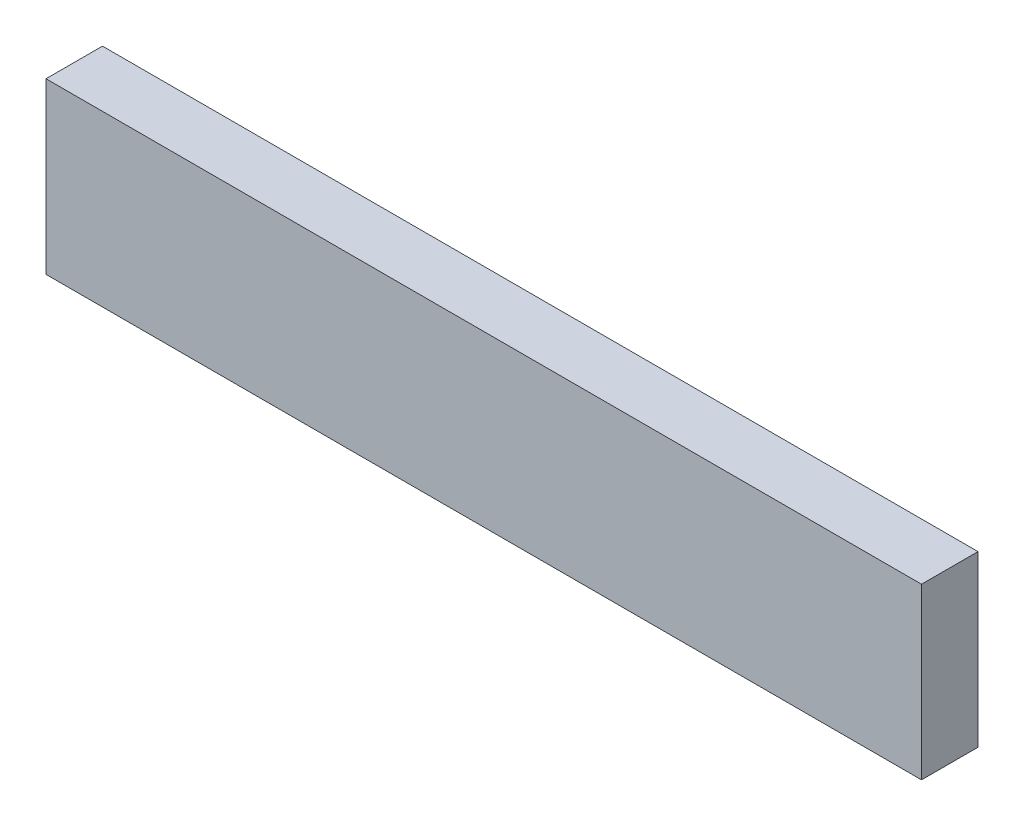
ISO-10303-21;
HEADER;
FILE_DESCRIPTION(('STEP AP214'),'2;1');
FILE_NAME('part.step','',(''),(''),'','','');
FILE_SCHEMA(('AUTOMOTIVE_DESIGN { 1 0 10303 214 1 1 1 1 }'));
ENDSEC;
DATA;
#1=APPLICATION_CONTEXT('core data for automotive mechanical design processes');
#2=APPLICATION_PROTOCOL_DEFINITION('international standard','automotive_design',2000,#1);
#3=PRODUCT_CONTEXT('',#1,'mechanical');
#4=PRODUCT('Part','Part','',(#3));
#5=PRODUCT_RELATED_PRODUCT_CATEGORY('part','',(#4));
#6=PRODUCT_DEFINITION_FORMATION('','',#4);
#7=PRODUCT_DEFINITION_CONTEXT('part definition',#1,'design');
#8=PRODUCT_DEFINITION('design','',#6,#7);
#9=PRODUCT_DEFINITION_SHAPE('','',#8);
#10=(LENGTH_UNIT() NAMED_UNIT(*) SI_UNIT(.MILLI.,.METRE.));
#11=(NAMED_UNIT(*) PLANE_ANGLE_UNIT() SI_UNIT($,.RADIAN.));
#12=(NAMED_UNIT(*) SI_UNIT($,.STERADIAN.) SOLID_ANGLE_UNIT());
#13=UNCERTAINTY_MEASURE_WITH_UNIT(LENGTH_MEASURE(1.E-05),#10,'distance_accuracy_value','');
#14=(GEOMETRIC_REPRESENTATION_CONTEXT(3) GLOBAL_UNCERTAINTY_ASSIGNED_CONTEXT((#13)) GLOBAL_UNIT_ASSIGNED_CONTEXT((#10,
#11,#12)) REPRESENTATION_CONTEXT('',''));
#15=CARTESIAN_POINT('',(0.,0.,0.));
#16=DIRECTION('',(0.,0.,1.));
#17=DIRECTION('',(1.,0.,0.));
#18=AXIS2_PLACEMENT_3D('',#15,#16,#17);
#19=CARTESIAN_POINT('',(155.,-30.,20.));
#20=DIRECTION('',(-1.,0.,0.));
#21=DIRECTION('',(0.,0.,1.));
#22=AXIS2_PLACEMENT_3D('',#19,#20,#21);
#23=PLANE('',#22);
#24=DIRECTION('',(0.,1.,0.));
#25=VECTOR('',#24,1.);
#26=CARTESIAN_POINT('',(155.,-30.,0.));
#27=LINE('',#26,#25);
#28=CARTESIAN_POINT('',(155.,-30.,0.));
#29=VERTEX_POINT('',#28);
#30=CARTESIAN_POINT('',(155.,30.,0.));
#31=VERTEX_POINT('',#30);
#32=EDGE_CURVE('E113',#29,#31,#27,.T.);
#33=ORIENTED_EDGE('',*,*,#32,.T.);
#34=DIRECTION('',(0.,0.,-1.));
#35=VECTOR('',#34,1.);
#36=CARTESIAN_POINT('',(155.,30.,20.));
#37=LINE('',#36,#35);
#38=CARTESIAN_POINT('',(155.,30.,20.));
#39=VERTEX_POINT('',#38);
#40=EDGE_CURVE('E11',#39,#31,#37,.T.);
#41=ORIENTED_EDGE('',*,*,#40,.F.);
#42=DIRECTION('',(0.,1.,0.));
#43=VECTOR('',#42,1.);
#44=CARTESIAN_POINT('',(155.,-30.,20.));
#45=LINE('',#44,#43);
#46=CARTESIAN_POINT('',(155.,-30.,20.));
#47=VERTEX_POINT('',#46);
#48=EDGE_CURVE('E97',#47,#39,#45,.T.);
#49=ORIENTED_EDGE('',*,*,#48,.F.);
#50=DIRECTION('',(0.,0.,-1.));
#51=VECTOR('',#50,1.);
#52=CARTESIAN_POINT('',(155.,-30.,20.));
#53=LINE('',#52,#51);
#54=EDGE_CURVE('E109',#47,#29,#53,.T.);
#55=ORIENTED_EDGE('',*,*,#54,.T.);
#56=EDGE_LOOP('',(#33,#41,#49,#55));
#57=FACE_BOUND('',#56,.T.);
#58=ADVANCED_FACE('F45',(#57),#23,.F.);
#59=CARTESIAN_POINT('',(-155.,30.,20.));
#60=DIRECTION('',(0.,-1.,0.));
#61=DIRECTION('',(0.,0.,-1.));
#62=AXIS2_PLACEMENT_3D('',#59,#60,#61);
#63=PLANE('',#62);
#64=DIRECTION('',(-1.,0.,0.));
#65=VECTOR('',#64,1.);
#66=CARTESIAN_POINT('',(-155.,30.,0.));
#67=LINE('',#66,#65);
#68=CARTESIAN_POINT('',(-155.,30.,0.));
#69=VERTEX_POINT('',#68);
#70=EDGE_CURVE('E102',#31,#69,#67,.T.);
#71=ORIENTED_EDGE('',*,*,#70,.T.);
#72=DIRECTION('',(0.,0.,-1.));
#73=VECTOR('',#72,1.);
#74=CARTESIAN_POINT('',(-155.,30.,20.));
#75=LINE('',#74,#73);
#76=CARTESIAN_POINT('',(-155.,30.,20.));
#77=VERTEX_POINT('',#76);
#78=EDGE_CURVE('E54',#77,#69,#75,.T.);
#79=ORIENTED_EDGE('',*,*,#78,.F.);
#80=DIRECTION('',(-1.,0.,0.));
#81=VECTOR('',#80,1.);
#82=CARTESIAN_POINT('',(-155.,30.,20.));
#83=LINE('',#82,#81);
#84=EDGE_CURVE('E92',#39,#77,#83,.T.);
#85=ORIENTED_EDGE('',*,*,#84,.F.);
#86=ORIENTED_EDGE('',*,*,#40,.T.);
#87=EDGE_LOOP('',(#71,#79,#85,#86));
#88=FACE_BOUND('',#87,.T.);
#89=ADVANCED_FACE('F101',(#88),#63,.F.);
#90=CARTESIAN_POINT('',(-155.,-30.,20.));
#91=DIRECTION('',(1.,0.,0.));
#92=DIRECTION('',(0.,0.,-1.));
#93=AXIS2_PLACEMENT_3D('',#90,#91,#92);
#94=PLANE('',#93);
#95=DIRECTION('',(0.,-1.,0.));
#96=VECTOR('',#95,1.);
#97=CARTESIAN_POINT('',(-155.,-30.,0.));
#98=LINE('',#97,#96);
#99=CARTESIAN_POINT('',(-155.,-30.,0.));
#100=VERTEX_POINT('',#99);
#101=EDGE_CURVE('E79',#69,#100,#98,.T.);
#102=ORIENTED_EDGE('',*,*,#101,.T.);
#103=DIRECTION('',(0.,0.,-1.));
#104=VECTOR('',#103,1.);
#105=CARTESIAN_POINT('',(-155.,-30.,20.));
#106=LINE('',#105,#104);
#107=CARTESIAN_POINT('',(-155.,-30.,20.));
#108=VERTEX_POINT('',#107);
#109=EDGE_CURVE('E104',#108,#100,#106,.T.);
#110=ORIENTED_EDGE('',*,*,#109,.F.);
#111=DIRECTION('',(0.,-1.,0.));
#112=VECTOR('',#111,1.);
#113=CARTESIAN_POINT('',(-155.,-30.,20.));
#114=LINE('',#113,#112);
#115=EDGE_CURVE('E95',#77,#108,#114,.T.);
#116=ORIENTED_EDGE('',*,*,#115,.F.);
#117=ORIENTED_EDGE('',*,*,#78,.T.);
#118=EDGE_LOOP('',(#102,#110,#116,#117));
#119=FACE_BOUND('',#118,.T.);
#120=ADVANCED_FACE('F105',(#119),#94,.F.);
#121=CARTESIAN_POINT('',(-155.,-30.,20.));
#122=DIRECTION('',(0.,1.,0.));
#123=DIRECTION('',(0.,0.,1.));
#124=AXIS2_PLACEMENT_3D('',#121,#122,#123);
#125=PLANE('',#124);
#126=DIRECTION('',(1.,0.,0.));
#127=VECTOR('',#126,1.);
#128=CARTESIAN_POINT('',(-155.,-30.,0.));
#129=LINE('',#128,#127);
#130=EDGE_CURVE('E85',#100,#29,#129,.T.);
#131=ORIENTED_EDGE('',*,*,#130,.T.);
#132=ORIENTED_EDGE('',*,*,#54,.F.);
#133=DIRECTION('',(1.,0.,0.));
#134=VECTOR('',#133,1.);
#135=CARTESIAN_POINT('',(-155.,-30.,20.));
#136=LINE('',#135,#134);
#137=EDGE_CURVE('E62',#108,#47,#136,.T.);
#138=ORIENTED_EDGE('',*,*,#137,.F.);
#139=ORIENTED_EDGE('',*,*,#109,.T.);
#140=EDGE_LOOP('',(#131,#132,#138,#139));
#141=FACE_BOUND('',#140,.T.);
#142=ADVANCED_FACE('F126',(#141),#125,.F.);
#143=CARTESIAN_POINT('',(0.,0.,20.));
#144=DIRECTION('',(0.,0.,-1.));
#145=DIRECTION('',(-1.,0.,0.));
#146=AXIS2_PLACEMENT_3D('',#143,#144,#145);
#147=PLANE('',#146);
#148=ORIENTED_EDGE('',*,*,#48,.T.);
#149=ORIENTED_EDGE('',*,*,#84,.T.);
#150=ORIENTED_EDGE('',*,*,#115,.T.);
#151=ORIENTED_EDGE('',*,*,#137,.T.);
#152=EDGE_LOOP('',(#148,#149,#150,#151));
#153=FACE_BOUND('',#152,.T.);
#154=ADVANCED_FACE('F93',(#153),#147,.F.);
#155=CARTESIAN_POINT('',(0.,0.,0.));
#156=DIRECTION('',(0.,0.,-1.));
#157=DIRECTION('',(-1.,0.,0.));
#158=AXIS2_PLACEMENT_3D('',#155,#156,#157);
#159=PLANE('',#158);
#160=ORIENTED_EDGE('',*,*,#32,.F.);
#161=ORIENTED_EDGE('',*,*,#130,.F.);
#162=ORIENTED_EDGE('',*,*,#101,.F.);
#163=ORIENTED_EDGE('',*,*,#70,.F.);
#164=EDGE_LOOP('',(#160,#161,#162,#163));
#165=FACE_BOUND('',#164,.T.);
#166=ADVANCED_FACE('F129',(#165),#159,.T.);
#167=CLOSED_SHELL('',(#58,#89,#120,#142,#154,#166));
#168=MANIFOLD_SOLID_BREP('B2',#167);
#169=ADVANCED_BREP_SHAPE_REPRESENTATION('',(#18,#168),#14);
#170=SHAPE_DEFINITION_REPRESENTATION(#9,#169);
ENDSEC;
END-ISO-10303-21;
